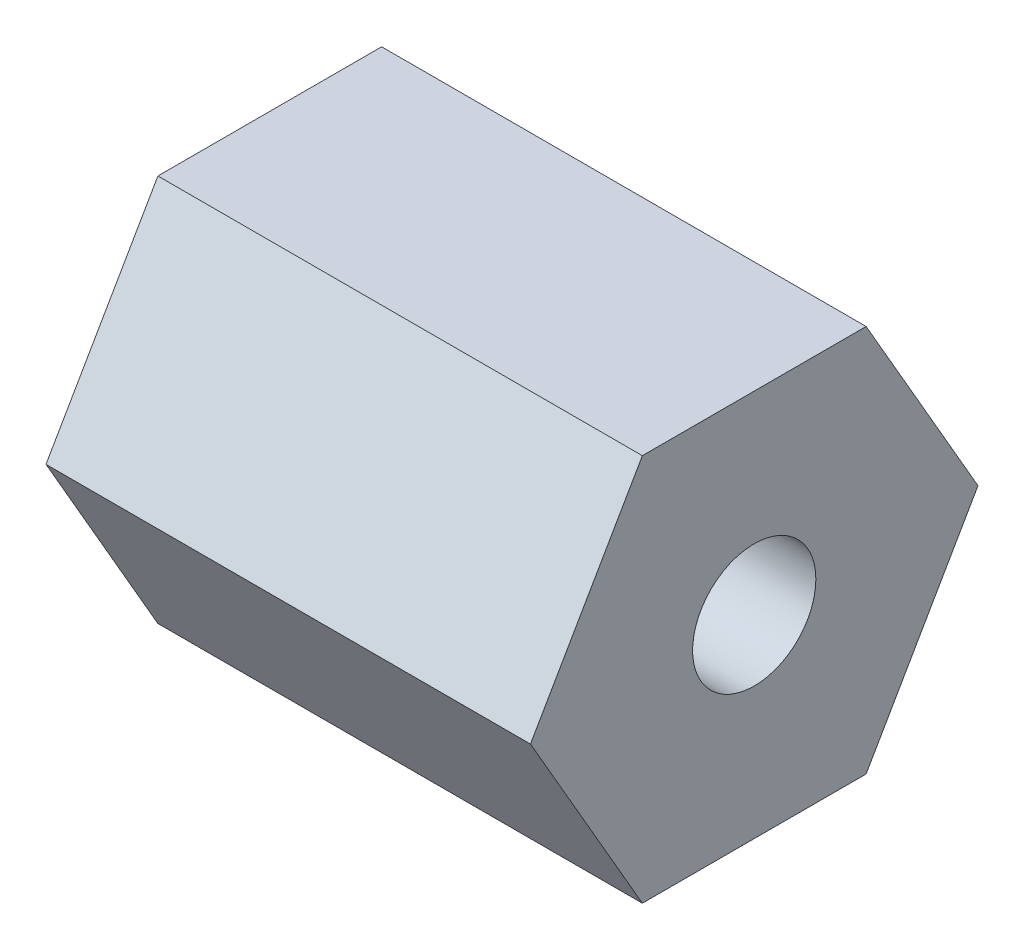
ISO-10303-21;
HEADER;
FILE_DESCRIPTION(('STEP AP214'),'2;1');
FILE_NAME('part.step','',(''),(''),'','','');
FILE_SCHEMA(('AUTOMOTIVE_DESIGN { 1 0 10303 214 1 1 1 1 }'));
ENDSEC;
DATA;
#1=APPLICATION_CONTEXT('core data for automotive mechanical design processes');
#2=APPLICATION_PROTOCOL_DEFINITION('international standard','automotive_design',2000,#1);
#3=PRODUCT_CONTEXT('',#1,'mechanical');
#4=PRODUCT('Part','Part','',(#3));
#5=PRODUCT_RELATED_PRODUCT_CATEGORY('part','',(#4));
#6=PRODUCT_DEFINITION_FORMATION('','',#4);
#7=PRODUCT_DEFINITION_CONTEXT('part definition',#1,'design');
#8=PRODUCT_DEFINITION('design','',#6,#7);
#9=PRODUCT_DEFINITION_SHAPE('','',#8);
#10=(LENGTH_UNIT() NAMED_UNIT(*) SI_UNIT(.MILLI.,.METRE.));
#11=(NAMED_UNIT(*) PLANE_ANGLE_UNIT() SI_UNIT($,.RADIAN.));
#12=(NAMED_UNIT(*) SI_UNIT($,.STERADIAN.) SOLID_ANGLE_UNIT());
#13=UNCERTAINTY_MEASURE_WITH_UNIT(LENGTH_MEASURE(1.E-05),#10,'distance_accuracy_value','');
#14=(GEOMETRIC_REPRESENTATION_CONTEXT(3) GLOBAL_UNCERTAINTY_ASSIGNED_CONTEXT((#13)) GLOBAL_UNIT_ASSIGNED_CONTEXT((#10,
#11,#12)) REPRESENTATION_CONTEXT('',''));
#15=CARTESIAN_POINT('',(0.,0.,0.));
#16=DIRECTION('',(0.,0.,1.));
#17=DIRECTION('',(1.,0.,0.));
#18=AXIS2_PLACEMENT_3D('',#15,#16,#17);
#19=CARTESIAN_POINT('',(7.9375,-6.34999999999992,-3.66617420935418));
#20=DIRECTION('',(0.,0.499999999999995,0.866025403784441));
#21=DIRECTION('',(0.,-0.866025403784442,0.499999999999995));
#22=AXIS2_PLACEMENT_3D('',#19,#20,#21);
#23=PLANE('',#22);
#24=DIRECTION('',(0.,0.866025403784441,-0.499999999999995));
#25=VECTOR('',#24,1.);
#26=CARTESIAN_POINT('',(-7.9375,-6.34999999999992,-3.66617420935418));
#27=LINE('',#26,#25);
#28=CARTESIAN_POINT('',(-7.9375,-6.34999999999992,-3.66617420935418));
#29=VERTEX_POINT('',#28);
#30=CARTESIAN_POINT('',(-7.9375,0.,-7.33234841870821));
#31=VERTEX_POINT('',#30);
#32=EDGE_CURVE('E130',#29,#31,#27,.T.);
#33=ORIENTED_EDGE('',*,*,#32,.T.);
#34=DIRECTION('',(-1.,0.,0.));
#35=VECTOR('',#34,1.);
#36=CARTESIAN_POINT('',(7.9375,0.,-7.33234841870821));
#37=LINE('',#36,#35);
#38=CARTESIAN_POINT('',(7.9375,0.,-7.33234841870821));
#39=VERTEX_POINT('',#38);
#40=EDGE_CURVE('E11',#39,#31,#37,.T.);
#41=ORIENTED_EDGE('',*,*,#40,.F.);
#42=DIRECTION('',(0.,0.866025403784441,-0.499999999999995));
#43=VECTOR('',#42,1.);
#44=CARTESIAN_POINT('',(7.9375,-6.34999999999992,-3.66617420935418));
#45=LINE('',#44,#43);
#46=CARTESIAN_POINT('',(7.9375,-6.34999999999992,-3.66617420935418));
#47=VERTEX_POINT('',#46);
#48=EDGE_CURVE('E140',#47,#39,#45,.T.);
#49=ORIENTED_EDGE('',*,*,#48,.F.);
#50=DIRECTION('',(-1.,0.,0.));
#51=VECTOR('',#50,1.);
#52=CARTESIAN_POINT('',(7.9375,-6.34999999999992,-3.66617420935418));
#53=LINE('',#52,#51);
#54=EDGE_CURVE('E126',#47,#29,#53,.T.);
#55=ORIENTED_EDGE('',*,*,#54,.T.);
#56=EDGE_LOOP('',(#33,#41,#49,#55));
#57=FACE_BOUND('',#56,.T.);
#58=ADVANCED_FACE('F45',(#57),#23,.F.);
#59=CARTESIAN_POINT('',(7.9375,0.,-7.33234841870821));
#60=DIRECTION('',(0.,-0.500000000000001,0.866025403784438));
#61=DIRECTION('',(0.,-0.866025403784438,-0.500000000000001));
#62=AXIS2_PLACEMENT_3D('',#59,#60,#61);
#63=PLANE('',#62);
#64=DIRECTION('',(0.,0.866025403784438,0.500000000000001));
#65=VECTOR('',#64,1.);
#66=CARTESIAN_POINT('',(-7.9375,0.,-7.33234841870821));
#67=LINE('',#66,#65);
#68=CARTESIAN_POINT('',(-7.9375,6.34999999999998,-3.66617420935409));
#69=VERTEX_POINT('',#68);
#70=EDGE_CURVE('E133',#31,#69,#67,.T.);
#71=ORIENTED_EDGE('',*,*,#70,.T.);
#72=DIRECTION('',(-1.,0.,0.));
#73=VECTOR('',#72,1.);
#74=CARTESIAN_POINT('',(7.9375,6.34999999999998,-3.66617420935409));
#75=LINE('',#74,#73);
#76=CARTESIAN_POINT('',(7.9375,6.34999999999998,-3.66617420935409));
#77=VERTEX_POINT('',#76);
#78=EDGE_CURVE('E54',#77,#69,#75,.T.);
#79=ORIENTED_EDGE('',*,*,#78,.F.);
#80=DIRECTION('',(0.,0.866025403784438,0.500000000000001));
#81=VECTOR('',#80,1.);
#82=CARTESIAN_POINT('',(7.9375,0.,-7.33234841870821));
#83=LINE('',#82,#81);
#84=EDGE_CURVE('E99',#39,#77,#83,.T.);
#85=ORIENTED_EDGE('',*,*,#84,.F.);
#86=ORIENTED_EDGE('',*,*,#40,.T.);
#87=EDGE_LOOP('',(#71,#79,#85,#86));
#88=FACE_BOUND('',#87,.T.);
#89=ADVANCED_FACE('F166',(#88),#63,.F.);
#90=CARTESIAN_POINT('',(7.9375,6.34999999999998,-3.66617420935409));
#91=DIRECTION('',(0.,-1.,0.));
#92=DIRECTION('',(0.,0.,-1.));
#93=AXIS2_PLACEMENT_3D('',#90,#91,#92);
#94=PLANE('',#93);
#95=DIRECTION('',(0.,0.,1.));
#96=VECTOR('',#95,1.);
#97=CARTESIAN_POINT('',(-7.9375,6.34999999999998,-3.66617420935409));
#98=LINE('',#97,#96);
#99=CARTESIAN_POINT('',(-7.9375,6.34999999999995,3.66617420935413));
#100=VERTEX_POINT('',#99);
#101=EDGE_CURVE('E135',#69,#100,#98,.T.);
#102=ORIENTED_EDGE('',*,*,#101,.T.);
#103=DIRECTION('',(-1.,0.,0.));
#104=VECTOR('',#103,1.);
#105=CARTESIAN_POINT('',(7.9375,6.34999999999995,3.66617420935413));
#106=LINE('',#105,#104);
#107=CARTESIAN_POINT('',(7.9375,6.34999999999995,3.66617420935413));
#108=VERTEX_POINT('',#107);
#109=EDGE_CURVE('E121',#108,#100,#106,.T.);
#110=ORIENTED_EDGE('',*,*,#109,.F.);
#111=DIRECTION('',(0.,0.,1.));
#112=VECTOR('',#111,1.);
#113=CARTESIAN_POINT('',(7.9375,6.34999999999998,-3.66617420935409));
#114=LINE('',#113,#112);
#115=EDGE_CURVE('E112',#77,#108,#114,.T.);
#116=ORIENTED_EDGE('',*,*,#115,.F.);
#117=ORIENTED_EDGE('',*,*,#78,.T.);
#118=EDGE_LOOP('',(#102,#110,#116,#117));
#119=FACE_BOUND('',#118,.T.);
#120=ADVANCED_FACE('F147',(#119),#94,.F.);
#121=CARTESIAN_POINT('',(7.9375,6.34999999999995,3.66617420935413));
#122=DIRECTION('',(0.,-0.499999999999995,-0.866025403784442));
#123=DIRECTION('',(0.,0.866025403784442,-0.499999999999995));
#124=AXIS2_PLACEMENT_3D('',#121,#122,#123);
#125=PLANE('',#124);
#126=DIRECTION('',(0.,-0.866025403784442,0.499999999999995));
#127=VECTOR('',#126,1.);
#128=CARTESIAN_POINT('',(-7.9375,6.34999999999995,3.66617420935413));
#129=LINE('',#128,#127);
#130=CARTESIAN_POINT('',(-7.9375,0.,7.33234841870821));
#131=VERTEX_POINT('',#130);
#132=EDGE_CURVE('E120',#100,#131,#129,.T.);
#133=ORIENTED_EDGE('',*,*,#132,.T.);
#134=DIRECTION('',(-1.,0.,0.));
#135=VECTOR('',#134,1.);
#136=CARTESIAN_POINT('',(7.9375,0.,7.33234841870821));
#137=LINE('',#136,#135);
#138=CARTESIAN_POINT('',(7.9375,0.,7.33234841870821));
#139=VERTEX_POINT('',#138);
#140=EDGE_CURVE('E117',#139,#131,#137,.T.);
#141=ORIENTED_EDGE('',*,*,#140,.F.);
#142=DIRECTION('',(0.,-0.866025403784442,0.499999999999995));
#143=VECTOR('',#142,1.);
#144=CARTESIAN_POINT('',(7.9375,6.34999999999995,3.66617420935413));
#145=LINE('',#144,#143);
#146=EDGE_CURVE('E106',#108,#139,#145,.T.);
#147=ORIENTED_EDGE('',*,*,#146,.F.);
#148=ORIENTED_EDGE('',*,*,#109,.T.);
#149=EDGE_LOOP('',(#133,#141,#147,#148));
#150=FACE_BOUND('',#149,.T.);
#151=ADVANCED_FACE('F118',(#150),#125,.F.);
#152=CARTESIAN_POINT('',(7.9375,0.,7.33234841870821));
#153=DIRECTION('',(0.,0.500000000000007,-0.866025403784434));
#154=DIRECTION('',(0.,0.866025403784435,0.500000000000007));
#155=AXIS2_PLACEMENT_3D('',#152,#153,#154);
#156=PLANE('',#155);
#157=DIRECTION('',(0.,-0.866025403784434,-0.500000000000007));
#158=VECTOR('',#157,1.);
#159=CARTESIAN_POINT('',(-7.9375,0.,7.33234841870821));
#160=LINE('',#159,#158);
#161=CARTESIAN_POINT('',(-7.9375,-6.35,3.66617420935405));
#162=VERTEX_POINT('',#161);
#163=EDGE_CURVE('E85',#131,#162,#160,.T.);
#164=ORIENTED_EDGE('',*,*,#163,.T.);
#165=DIRECTION('',(-1.,0.,0.));
#166=VECTOR('',#165,1.);
#167=CARTESIAN_POINT('',(7.9375,-6.35,3.66617420935405));
#168=LINE('',#167,#166);
#169=CARTESIAN_POINT('',(7.9375,-6.35,3.66617420935405));
#170=VERTEX_POINT('',#169);
#171=EDGE_CURVE('E122',#170,#162,#168,.T.);
#172=ORIENTED_EDGE('',*,*,#171,.F.);
#173=DIRECTION('',(0.,-0.866025403784434,-0.500000000000007));
#174=VECTOR('',#173,1.);
#175=CARTESIAN_POINT('',(7.9375,0.,7.33234841870821));
#176=LINE('',#175,#174);
#177=EDGE_CURVE('E110',#139,#170,#176,.T.);
#178=ORIENTED_EDGE('',*,*,#177,.F.);
#179=ORIENTED_EDGE('',*,*,#140,.T.);
#180=EDGE_LOOP('',(#164,#172,#178,#179));
#181=FACE_BOUND('',#180,.T.);
#182=ADVANCED_FACE('F124',(#181),#156,.F.);
#183=CARTESIAN_POINT('',(7.9375,-6.35,3.66617420935405));
#184=DIRECTION('',(0.,1.,0.));
#185=DIRECTION('',(0.,0.,1.));
#186=AXIS2_PLACEMENT_3D('',#183,#184,#185);
#187=PLANE('',#186);
#188=DIRECTION('',(0.,0.,-1.));
#189=VECTOR('',#188,1.);
#190=CARTESIAN_POINT('',(-7.9375,-6.35,3.66617420935405));
#191=LINE('',#190,#189);
#192=EDGE_CURVE('E91',#162,#29,#191,.T.);
#193=ORIENTED_EDGE('',*,*,#192,.T.);
#194=ORIENTED_EDGE('',*,*,#54,.F.);
#195=DIRECTION('',(0.,0.,-1.));
#196=VECTOR('',#195,1.);
#197=CARTESIAN_POINT('',(7.9375,-6.35,3.66617420935405));
#198=LINE('',#197,#196);
#199=EDGE_CURVE('E62',#170,#47,#198,.T.);
#200=ORIENTED_EDGE('',*,*,#199,.F.);
#201=ORIENTED_EDGE('',*,*,#171,.T.);
#202=EDGE_LOOP('',(#193,#194,#200,#201));
#203=FACE_BOUND('',#202,.T.);
#204=ADVANCED_FACE('F154',(#203),#187,.F.);
#205=CARTESIAN_POINT('',(7.9375,0.,0.));
#206=DIRECTION('',(1.,0.,0.));
#207=DIRECTION('',(0.,0.,-1.));
#208=AXIS2_PLACEMENT_3D('',#205,#206,#207);
#209=PLANE('',#208);
#210=CARTESIAN_POINT('',(7.9375,0.,0.));
#211=DIRECTION('',(1.,0.,0.));
#212=DIRECTION('',(0.,0.,-1.));
#213=AXIS2_PLACEMENT_3D('',#210,#211,#212);
#214=CIRCLE('',#213,2.01929999999999);
#215=CARTESIAN_POINT('',(7.9375,0.,-2.01930000000001));
#216=VERTEX_POINT('',#215);
#217=EDGE_CURVE('E269',#216,#216,#214,.T.);
#218=ORIENTED_EDGE('',*,*,#217,.F.);
#219=EDGE_LOOP('',(#218));
#220=FACE_BOUND('',#219,.T.);
#221=ORIENTED_EDGE('',*,*,#48,.T.);
#222=ORIENTED_EDGE('',*,*,#84,.T.);
#223=ORIENTED_EDGE('',*,*,#115,.T.);
#224=ORIENTED_EDGE('',*,*,#146,.T.);
#225=ORIENTED_EDGE('',*,*,#177,.T.);
#226=ORIENTED_EDGE('',*,*,#199,.T.);
#227=EDGE_LOOP('',(#221,#222,#223,#224,#225,#226));
#228=FACE_BOUND('',#227,.T.);
#229=ADVANCED_FACE('F108',(#220,#228),#209,.T.);
#230=CARTESIAN_POINT('',(-7.9375,0.,0.));
#231=DIRECTION('',(1.,0.,0.));
#232=DIRECTION('',(0.,0.,-1.));
#233=AXIS2_PLACEMENT_3D('',#230,#231,#232);
#234=PLANE('',#233);
#235=CARTESIAN_POINT('',(-7.9375,0.,0.));
#236=DIRECTION('',(1.,0.,0.));
#237=DIRECTION('',(0.,0.,-1.));
#238=AXIS2_PLACEMENT_3D('',#235,#236,#237);
#239=CIRCLE('',#238,2.01929999999999);
#240=CARTESIAN_POINT('',(-7.9375,0.,-2.01930000000001));
#241=VERTEX_POINT('',#240);
#242=EDGE_CURVE('E48',#241,#241,#239,.T.);
#243=ORIENTED_EDGE('',*,*,#242,.T.);
#244=EDGE_LOOP('',(#243));
#245=FACE_BOUND('',#244,.T.);
#246=ORIENTED_EDGE('',*,*,#32,.F.);
#247=ORIENTED_EDGE('',*,*,#192,.F.);
#248=ORIENTED_EDGE('',*,*,#163,.F.);
#249=ORIENTED_EDGE('',*,*,#132,.F.);
#250=ORIENTED_EDGE('',*,*,#101,.F.);
#251=ORIENTED_EDGE('',*,*,#70,.F.);
#252=EDGE_LOOP('',(#246,#247,#248,#249,#250,#251));
#253=FACE_BOUND('',#252,.T.);
#254=ADVANCED_FACE('F150',(#245,#253),#234,.F.);
#255=CARTESIAN_POINT('',(7.9375,0.,0.));
#256=DIRECTION('',(1.,0.,0.));
#257=DIRECTION('',(0.,0.,-1.));
#258=AXIS2_PLACEMENT_3D('',#255,#256,#257);
#259=CYLINDRICAL_SURFACE('',#258,2.01929999999999);
#260=ORIENTED_EDGE('',*,*,#217,.T.);
#261=EDGE_LOOP('',(#260));
#262=FACE_BOUND('',#261,.T.);
#263=ORIENTED_EDGE('',*,*,#242,.F.);
#264=EDGE_LOOP('',(#263));
#265=FACE_BOUND('',#264,.T.);
#266=ADVANCED_FACE('F210',(#262,#265),#259,.F.);
#267=CLOSED_SHELL('',(#58,#89,#120,#151,#182,#204,#229,#254,#266));
#268=MANIFOLD_SOLID_BREP('B2',#267);
#269=ADVANCED_BREP_SHAPE_REPRESENTATION('',(#18,#268),#14);
#270=SHAPE_DEFINITION_REPRESENTATION(#9,#269);
ENDSEC;
END-ISO-10303-21;
